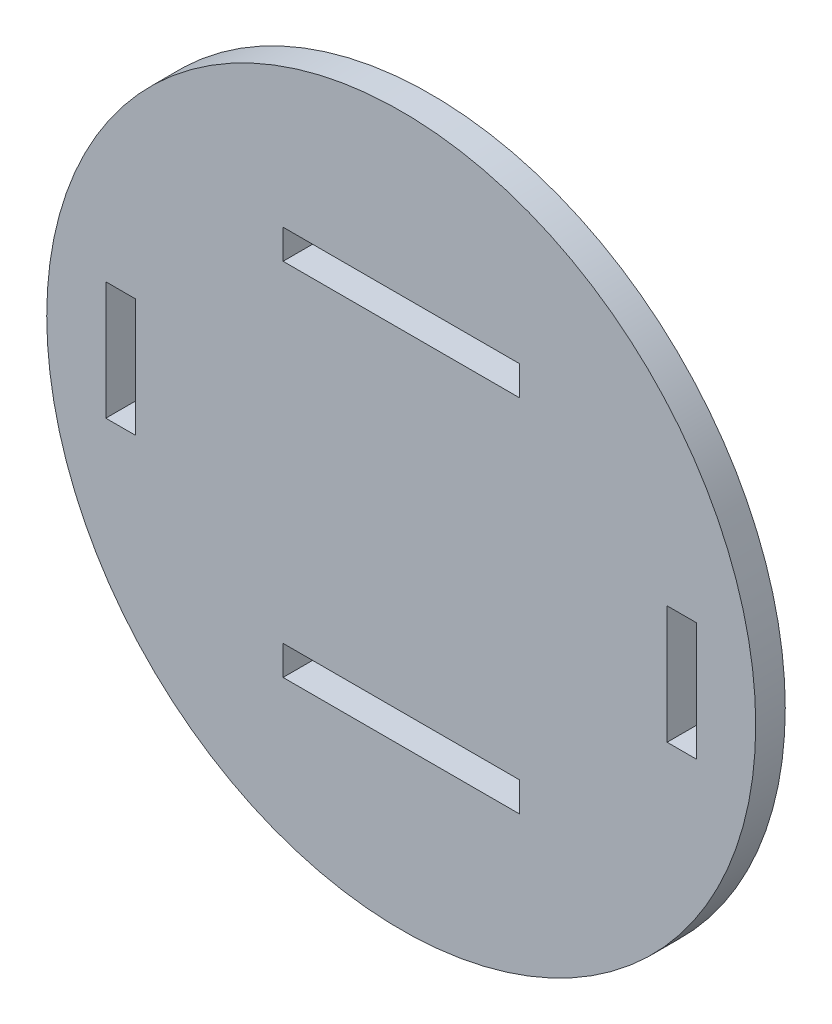
ISO-10303-21;
HEADER;
FILE_DESCRIPTION(('STEP AP214'),'2;1');
FILE_NAME('part.step','',(''),(''),'','','');
FILE_SCHEMA(('AUTOMOTIVE_DESIGN { 1 0 10303 214 1 1 1 1 }'));
ENDSEC;
DATA;
#1=APPLICATION_CONTEXT('core data for automotive mechanical design processes');
#2=APPLICATION_PROTOCOL_DEFINITION('international standard','automotive_design',2000,#1);
#3=PRODUCT_CONTEXT('',#1,'mechanical');
#4=PRODUCT('Part','Part','',(#3));
#5=PRODUCT_RELATED_PRODUCT_CATEGORY('part','',(#4));
#6=PRODUCT_DEFINITION_FORMATION('','',#4);
#7=PRODUCT_DEFINITION_CONTEXT('part definition',#1,'design');
#8=PRODUCT_DEFINITION('design','',#6,#7);
#9=PRODUCT_DEFINITION_SHAPE('','',#8);
#10=(LENGTH_UNIT() NAMED_UNIT(*) SI_UNIT(.MILLI.,.METRE.));
#11=(NAMED_UNIT(*) PLANE_ANGLE_UNIT() SI_UNIT($,.RADIAN.));
#12=(NAMED_UNIT(*) SI_UNIT($,.STERADIAN.) SOLID_ANGLE_UNIT());
#13=UNCERTAINTY_MEASURE_WITH_UNIT(LENGTH_MEASURE(1.E-05),#10,'distance_accuracy_value','');
#14=(GEOMETRIC_REPRESENTATION_CONTEXT(3) GLOBAL_UNCERTAINTY_ASSIGNED_CONTEXT((#13)) GLOBAL_UNIT_ASSIGNED_CONTEXT((#10,
#11,#12)) REPRESENTATION_CONTEXT('',''));
#15=CARTESIAN_POINT('',(0.,0.,0.));
#16=DIRECTION('',(0.,0.,1.));
#17=DIRECTION('',(1.,0.,0.));
#18=AXIS2_PLACEMENT_3D('',#15,#16,#17);
#19=CARTESIAN_POINT('',(0.,0.,3.175));
#20=DIRECTION('',(0.,0.,1.));
#21=DIRECTION('',(1.,0.,0.));
#22=AXIS2_PLACEMENT_3D('',#19,#20,#21);
#23=PLANE('',#22);
#24=CARTESIAN_POINT('',(0.,0.,3.175));
#25=DIRECTION('',(0.,0.,1.));
#26=DIRECTION('',(1.,0.,0.));
#27=AXIS2_PLACEMENT_3D('',#24,#25,#26);
#28=CIRCLE('',#27,38.1);
#29=CARTESIAN_POINT('',(38.1,0.,3.175));
#30=VERTEX_POINT('',#29);
#31=EDGE_CURVE('E11',#30,#30,#28,.T.);
#32=ORIENTED_EDGE('',*,*,#31,.T.);
#33=EDGE_LOOP('',(#32));
#34=FACE_BOUND('',#33,.T.);
#35=DIRECTION('',(0.,1.,0.));
#36=VECTOR('',#35,1.);
#37=CARTESIAN_POINT('',(31.75,6.35,3.175));
#38=LINE('',#37,#36);
#39=CARTESIAN_POINT('',(31.75,-6.35,3.175));
#40=VERTEX_POINT('',#39);
#41=CARTESIAN_POINT('',(31.75,6.35,3.175));
#42=VERTEX_POINT('',#41);
#43=EDGE_CURVE('E292',#40,#42,#38,.T.);
#44=ORIENTED_EDGE('',*,*,#43,.F.);
#45=DIRECTION('',(1.,0.,0.));
#46=VECTOR('',#45,1.);
#47=CARTESIAN_POINT('',(31.75,-6.35,3.175));
#48=LINE('',#47,#46);
#49=CARTESIAN_POINT('',(28.575,-6.35,3.175));
#50=VERTEX_POINT('',#49);
#51=EDGE_CURVE('E288',#50,#40,#48,.T.);
#52=ORIENTED_EDGE('',*,*,#51,.F.);
#53=DIRECTION('',(0.,-1.,0.));
#54=VECTOR('',#53,1.);
#55=CARTESIAN_POINT('',(28.575,-6.35,3.175));
#56=LINE('',#55,#54);
#57=CARTESIAN_POINT('',(28.575,6.35,3.175));
#58=VERTEX_POINT('',#57);
#59=EDGE_CURVE('E285',#58,#50,#56,.T.);
#60=ORIENTED_EDGE('',*,*,#59,.F.);
#61=DIRECTION('',(-1.,0.,0.));
#62=VECTOR('',#61,1.);
#63=CARTESIAN_POINT('',(28.575,6.35,3.175));
#64=LINE('',#63,#62);
#65=EDGE_CURVE('E295',#42,#58,#64,.T.);
#66=ORIENTED_EDGE('',*,*,#65,.F.);
#67=EDGE_LOOP('',(#44,#52,#60,#66));
#68=FACE_BOUND('',#67,.T.);
#69=DIRECTION('',(0.,-1.,0.));
#70=VECTOR('',#69,1.);
#71=CARTESIAN_POINT('',(-31.75,6.35,3.175));
#72=LINE('',#71,#70);
#73=CARTESIAN_POINT('',(-31.75,6.35,3.175));
#74=VERTEX_POINT('',#73);
#75=CARTESIAN_POINT('',(-31.75,-6.35,3.175));
#76=VERTEX_POINT('',#75);
#77=EDGE_CURVE('E251',#74,#76,#72,.T.);
#78=ORIENTED_EDGE('',*,*,#77,.F.);
#79=DIRECTION('',(-1.,0.,0.));
#80=VECTOR('',#79,1.);
#81=CARTESIAN_POINT('',(-28.575,6.35,3.175));
#82=LINE('',#81,#80);
#83=CARTESIAN_POINT('',(-28.575,6.35,3.175));
#84=VERTEX_POINT('',#83);
#85=EDGE_CURVE('E247',#84,#74,#82,.T.);
#86=ORIENTED_EDGE('',*,*,#85,.F.);
#87=DIRECTION('',(0.,1.,0.));
#88=VECTOR('',#87,1.);
#89=CARTESIAN_POINT('',(-28.575,0.,3.175));
#90=LINE('',#89,#88);
#91=CARTESIAN_POINT('',(-28.575,-6.35,3.175));
#92=VERTEX_POINT('',#91);
#93=EDGE_CURVE('E244',#92,#84,#90,.T.);
#94=ORIENTED_EDGE('',*,*,#93,.F.);
#95=DIRECTION('',(1.,0.,0.));
#96=VECTOR('',#95,1.);
#97=CARTESIAN_POINT('',(-31.75,-6.35,3.175));
#98=LINE('',#97,#96);
#99=EDGE_CURVE('E254',#76,#92,#98,.T.);
#100=ORIENTED_EDGE('',*,*,#99,.F.);
#101=EDGE_LOOP('',(#78,#86,#94,#100));
#102=FACE_BOUND('',#101,.T.);
#103=DIRECTION('',(1.,0.,0.));
#104=VECTOR('',#103,1.);
#105=CARTESIAN_POINT('',(12.7,-20.955,3.175));
#106=LINE('',#105,#104);
#107=CARTESIAN_POINT('',(-12.7,-20.955,3.175));
#108=VERTEX_POINT('',#107);
#109=CARTESIAN_POINT('',(12.7,-20.955,3.175));
#110=VERTEX_POINT('',#109);
#111=EDGE_CURVE('E212',#108,#110,#106,.T.);
#112=ORIENTED_EDGE('',*,*,#111,.F.);
#113=DIRECTION('',(0.,-1.,0.));
#114=VECTOR('',#113,1.);
#115=CARTESIAN_POINT('',(-12.7,-20.955,3.175));
#116=LINE('',#115,#114);
#117=CARTESIAN_POINT('',(-12.7,-17.78,3.175));
#118=VERTEX_POINT('',#117);
#119=EDGE_CURVE('E208',#118,#108,#116,.T.);
#120=ORIENTED_EDGE('',*,*,#119,.F.);
#121=DIRECTION('',(-1.,0.,0.));
#122=VECTOR('',#121,1.);
#123=CARTESIAN_POINT('',(-12.7,-17.78,3.175));
#124=LINE('',#123,#122);
#125=CARTESIAN_POINT('',(12.7,-17.78,3.175));
#126=VERTEX_POINT('',#125);
#127=EDGE_CURVE('E205',#126,#118,#124,.T.);
#128=ORIENTED_EDGE('',*,*,#127,.F.);
#129=DIRECTION('',(0.,1.,0.));
#130=VECTOR('',#129,1.);
#131=CARTESIAN_POINT('',(12.7,-17.78,3.175));
#132=LINE('',#131,#130);
#133=EDGE_CURVE('E215',#110,#126,#132,.T.);
#134=ORIENTED_EDGE('',*,*,#133,.F.);
#135=EDGE_LOOP('',(#112,#120,#128,#134));
#136=FACE_BOUND('',#135,.T.);
#137=DIRECTION('',(0.,1.,0.));
#138=VECTOR('',#137,1.);
#139=CARTESIAN_POINT('',(12.7,17.78,3.175));
#140=LINE('',#139,#138);
#141=CARTESIAN_POINT('',(12.7,17.78,3.175));
#142=VERTEX_POINT('',#141);
#143=CARTESIAN_POINT('',(12.7,20.955,3.175));
#144=VERTEX_POINT('',#143);
#145=EDGE_CURVE('E164',#142,#144,#140,.T.);
#146=ORIENTED_EDGE('',*,*,#145,.F.);
#147=DIRECTION('',(1.,0.,0.));
#148=VECTOR('',#147,1.);
#149=CARTESIAN_POINT('',(0.,17.78,3.175));
#150=LINE('',#149,#148);
#151=CARTESIAN_POINT('',(-12.7,17.78,3.175));
#152=VERTEX_POINT('',#151);
#153=EDGE_CURVE('E153',#152,#142,#150,.T.);
#154=ORIENTED_EDGE('',*,*,#153,.F.);
#155=DIRECTION('',(0.,-1.,0.));
#156=VECTOR('',#155,1.);
#157=CARTESIAN_POINT('',(-12.7,20.955,3.175));
#158=LINE('',#157,#156);
#159=CARTESIAN_POINT('',(-12.7,20.955,3.175));
#160=VERTEX_POINT('',#159);
#161=EDGE_CURVE('E181',#160,#152,#158,.T.);
#162=ORIENTED_EDGE('',*,*,#161,.F.);
#163=DIRECTION('',(-1.,0.,0.));
#164=VECTOR('',#163,1.);
#165=CARTESIAN_POINT('',(12.7,20.955,3.175));
#166=LINE('',#165,#164);
#167=EDGE_CURVE('E177',#144,#160,#166,.T.);
#168=ORIENTED_EDGE('',*,*,#167,.F.);
#169=EDGE_LOOP('',(#146,#154,#162,#168));
#170=FACE_BOUND('',#169,.T.);
#171=ADVANCED_FACE('F39',(#34,#68,#102,#136,#170),#23,.T.);
#172=CARTESIAN_POINT('',(0.,0.,0.));
#173=DIRECTION('',(0.,0.,1.));
#174=DIRECTION('',(1.,0.,0.));
#175=AXIS2_PLACEMENT_3D('',#172,#173,#174);
#176=PLANE('',#175);
#177=DIRECTION('',(0.,-1.,0.));
#178=VECTOR('',#177,1.);
#179=CARTESIAN_POINT('',(-12.7,-20.955,0.));
#180=LINE('',#179,#178);
#181=CARTESIAN_POINT('',(-12.7,-17.78,0.));
#182=VERTEX_POINT('',#181);
#183=CARTESIAN_POINT('',(-12.7,-20.955,0.));
#184=VERTEX_POINT('',#183);
#185=EDGE_CURVE('E218',#182,#184,#180,.T.);
#186=ORIENTED_EDGE('',*,*,#185,.T.);
#187=DIRECTION('',(1.,0.,0.));
#188=VECTOR('',#187,1.);
#189=CARTESIAN_POINT('',(12.7,-20.955,0.));
#190=LINE('',#189,#188);
#191=CARTESIAN_POINT('',(12.7,-20.955,0.));
#192=VERTEX_POINT('',#191);
#193=EDGE_CURVE('E222',#184,#192,#190,.T.);
#194=ORIENTED_EDGE('',*,*,#193,.T.);
#195=DIRECTION('',(0.,1.,0.));
#196=VECTOR('',#195,1.);
#197=CARTESIAN_POINT('',(12.7,-17.78,0.));
#198=LINE('',#197,#196);
#199=CARTESIAN_POINT('',(12.7,-17.78,0.));
#200=VERTEX_POINT('',#199);
#201=EDGE_CURVE('E227',#192,#200,#198,.T.);
#202=ORIENTED_EDGE('',*,*,#201,.T.);
#203=DIRECTION('',(-1.,0.,0.));
#204=VECTOR('',#203,1.);
#205=CARTESIAN_POINT('',(0.,-17.78,0.));
#206=LINE('',#205,#204);
#207=EDGE_CURVE('E209',#200,#182,#206,.T.);
#208=ORIENTED_EDGE('',*,*,#207,.T.);
#209=EDGE_LOOP('',(#186,#194,#202,#208));
#210=FACE_BOUND('',#209,.T.);
#211=DIRECTION('',(1.,0.,0.));
#212=VECTOR('',#211,1.);
#213=CARTESIAN_POINT('',(31.75,-6.35,0.));
#214=LINE('',#213,#212);
#215=CARTESIAN_POINT('',(28.575,-6.35,0.));
#216=VERTEX_POINT('',#215);
#217=CARTESIAN_POINT('',(31.75,-6.35,0.));
#218=VERTEX_POINT('',#217);
#219=EDGE_CURVE('E300',#216,#218,#214,.T.);
#220=ORIENTED_EDGE('',*,*,#219,.T.);
#221=DIRECTION('',(0.,1.,0.));
#222=VECTOR('',#221,1.);
#223=CARTESIAN_POINT('',(31.75,6.35,0.));
#224=LINE('',#223,#222);
#225=CARTESIAN_POINT('',(31.75,6.35,0.));
#226=VERTEX_POINT('',#225);
#227=EDGE_CURVE('E304',#218,#226,#224,.T.);
#228=ORIENTED_EDGE('',*,*,#227,.T.);
#229=DIRECTION('',(-1.,0.,0.));
#230=VECTOR('',#229,1.);
#231=CARTESIAN_POINT('',(28.575,6.35,0.));
#232=LINE('',#231,#230);
#233=CARTESIAN_POINT('',(28.575,6.35,0.));
#234=VERTEX_POINT('',#233);
#235=EDGE_CURVE('E308',#226,#234,#232,.T.);
#236=ORIENTED_EDGE('',*,*,#235,.T.);
#237=DIRECTION('',(0.,-1.,0.));
#238=VECTOR('',#237,1.);
#239=CARTESIAN_POINT('',(28.575,0.,0.));
#240=LINE('',#239,#238);
#241=EDGE_CURVE('E289',#234,#216,#240,.T.);
#242=ORIENTED_EDGE('',*,*,#241,.T.);
#243=EDGE_LOOP('',(#220,#228,#236,#242));
#244=FACE_BOUND('',#243,.T.);
#245=CARTESIAN_POINT('',(0.,0.,0.));
#246=DIRECTION('',(0.,0.,1.));
#247=DIRECTION('',(1.,0.,0.));
#248=AXIS2_PLACEMENT_3D('',#245,#246,#247);
#249=CIRCLE('',#248,38.1);
#250=CARTESIAN_POINT('',(38.1,0.,0.));
#251=VERTEX_POINT('',#250);
#252=EDGE_CURVE('E43',#251,#251,#249,.T.);
#253=ORIENTED_EDGE('',*,*,#252,.F.);
#254=EDGE_LOOP('',(#253));
#255=FACE_BOUND('',#254,.T.);
#256=DIRECTION('',(-1.,0.,0.));
#257=VECTOR('',#256,1.);
#258=CARTESIAN_POINT('',(-28.575,6.35,0.));
#259=LINE('',#258,#257);
#260=CARTESIAN_POINT('',(-28.575,6.35,0.));
#261=VERTEX_POINT('',#260);
#262=CARTESIAN_POINT('',(-31.75,6.35,0.));
#263=VERTEX_POINT('',#262);
#264=EDGE_CURVE('E259',#261,#263,#259,.T.);
#265=ORIENTED_EDGE('',*,*,#264,.T.);
#266=DIRECTION('',(0.,-1.,0.));
#267=VECTOR('',#266,1.);
#268=CARTESIAN_POINT('',(-31.75,6.35,0.));
#269=LINE('',#268,#267);
#270=CARTESIAN_POINT('',(-31.75,-6.35,0.));
#271=VERTEX_POINT('',#270);
#272=EDGE_CURVE('E263',#263,#271,#269,.T.);
#273=ORIENTED_EDGE('',*,*,#272,.T.);
#274=DIRECTION('',(1.,0.,0.));
#275=VECTOR('',#274,1.);
#276=CARTESIAN_POINT('',(-31.75,-6.35,0.));
#277=LINE('',#276,#275);
#278=CARTESIAN_POINT('',(-28.575,-6.35,0.));
#279=VERTEX_POINT('',#278);
#280=EDGE_CURVE('E268',#271,#279,#277,.T.);
#281=ORIENTED_EDGE('',*,*,#280,.T.);
#282=DIRECTION('',(0.,1.,0.));
#283=VECTOR('',#282,1.);
#284=CARTESIAN_POINT('',(-28.575,0.,0.));
#285=LINE('',#284,#283);
#286=EDGE_CURVE('E248',#279,#261,#285,.T.);
#287=ORIENTED_EDGE('',*,*,#286,.T.);
#288=EDGE_LOOP('',(#265,#273,#281,#287));
#289=FACE_BOUND('',#288,.T.);
#290=DIRECTION('',(1.,0.,0.));
#291=VECTOR('',#290,1.);
#292=CARTESIAN_POINT('',(0.,17.78,0.));
#293=LINE('',#292,#291);
#294=CARTESIAN_POINT('',(-12.7,17.78,0.));
#295=VERTEX_POINT('',#294);
#296=CARTESIAN_POINT('',(12.7,17.78,0.));
#297=VERTEX_POINT('',#296);
#298=EDGE_CURVE('E186',#295,#297,#293,.T.);
#299=ORIENTED_EDGE('',*,*,#298,.T.);
#300=DIRECTION('',(0.,1.,0.));
#301=VECTOR('',#300,1.);
#302=CARTESIAN_POINT('',(12.7,17.78,0.));
#303=LINE('',#302,#301);
#304=CARTESIAN_POINT('',(12.7,20.955,0.));
#305=VERTEX_POINT('',#304);
#306=EDGE_CURVE('E171',#297,#305,#303,.T.);
#307=ORIENTED_EDGE('',*,*,#306,.T.);
#308=DIRECTION('',(-1.,0.,0.));
#309=VECTOR('',#308,1.);
#310=CARTESIAN_POINT('',(12.7,20.955,0.));
#311=LINE('',#310,#309);
#312=CARTESIAN_POINT('',(-12.7,20.955,0.));
#313=VERTEX_POINT('',#312);
#314=EDGE_CURVE('E192',#305,#313,#311,.T.);
#315=ORIENTED_EDGE('',*,*,#314,.T.);
#316=DIRECTION('',(0.,-1.,0.));
#317=VECTOR('',#316,1.);
#318=CARTESIAN_POINT('',(-12.7,20.955,0.));
#319=LINE('',#318,#317);
#320=EDGE_CURVE('E165',#313,#295,#319,.T.);
#321=ORIENTED_EDGE('',*,*,#320,.T.);
#322=EDGE_LOOP('',(#299,#307,#315,#321));
#323=FACE_BOUND('',#322,.T.);
#324=ADVANCED_FACE('F336',(#210,#244,#255,#289,#323),#176,.F.);
#325=CARTESIAN_POINT('',(0.,0.,3.175));
#326=DIRECTION('',(0.,0.,-1.));
#327=DIRECTION('',(-1.,0.,0.));
#328=AXIS2_PLACEMENT_3D('',#325,#326,#327);
#329=CYLINDRICAL_SURFACE('',#328,38.1);
#330=ORIENTED_EDGE('',*,*,#31,.F.);
#331=EDGE_LOOP('',(#330));
#332=FACE_BOUND('',#331,.T.);
#333=ORIENTED_EDGE('',*,*,#252,.T.);
#334=EDGE_LOOP('',(#333));
#335=FACE_BOUND('',#334,.T.);
#336=ADVANCED_FACE('F41',(#332,#335),#329,.T.);
#337=CARTESIAN_POINT('',(31.75,-6.35,3.175));
#338=DIRECTION('',(0.,1.,0.));
#339=DIRECTION('',(0.,0.,1.));
#340=AXIS2_PLACEMENT_3D('',#337,#338,#339);
#341=PLANE('',#340);
#342=ORIENTED_EDGE('',*,*,#219,.F.);
#343=DIRECTION('',(0.,0.,-1.));
#344=VECTOR('',#343,1.);
#345=CARTESIAN_POINT('',(28.575,-6.35,3.175));
#346=LINE('',#345,#344);
#347=EDGE_CURVE('E264',#50,#216,#346,.T.);
#348=ORIENTED_EDGE('',*,*,#347,.F.);
#349=ORIENTED_EDGE('',*,*,#51,.T.);
#350=DIRECTION('',(0.,0.,-1.));
#351=VECTOR('',#350,1.);
#352=CARTESIAN_POINT('',(31.75,-6.35,3.175));
#353=LINE('',#352,#351);
#354=EDGE_CURVE('E320',#40,#218,#353,.T.);
#355=ORIENTED_EDGE('',*,*,#354,.T.);
#356=EDGE_LOOP('',(#342,#348,#349,#355));
#357=FACE_BOUND('',#356,.T.);
#358=ADVANCED_FACE('F332',(#357),#341,.T.);
#359=CARTESIAN_POINT('',(31.75,6.35,3.175));
#360=DIRECTION('',(-1.,0.,0.));
#361=DIRECTION('',(0.,0.,1.));
#362=AXIS2_PLACEMENT_3D('',#359,#360,#361);
#363=PLANE('',#362);
#364=ORIENTED_EDGE('',*,*,#227,.F.);
#365=ORIENTED_EDGE('',*,*,#354,.F.);
#366=ORIENTED_EDGE('',*,*,#43,.T.);
#367=DIRECTION('',(0.,0.,-1.));
#368=VECTOR('',#367,1.);
#369=CARTESIAN_POINT('',(31.75,6.35,3.175));
#370=LINE('',#369,#368);
#371=EDGE_CURVE('E317',#42,#226,#370,.T.);
#372=ORIENTED_EDGE('',*,*,#371,.T.);
#373=EDGE_LOOP('',(#364,#365,#366,#372));
#374=FACE_BOUND('',#373,.T.);
#375=ADVANCED_FACE('F347',(#374),#363,.T.);
#376=CARTESIAN_POINT('',(28.575,6.35,3.175));
#377=DIRECTION('',(0.,-1.,0.));
#378=DIRECTION('',(0.,0.,-1.));
#379=AXIS2_PLACEMENT_3D('',#376,#377,#378);
#380=PLANE('',#379);
#381=ORIENTED_EDGE('',*,*,#235,.F.);
#382=ORIENTED_EDGE('',*,*,#371,.F.);
#383=ORIENTED_EDGE('',*,*,#65,.T.);
#384=DIRECTION('',(0.,0.,-1.));
#385=VECTOR('',#384,1.);
#386=CARTESIAN_POINT('',(28.575,6.35,3.175));
#387=LINE('',#386,#385);
#388=EDGE_CURVE('E299',#58,#234,#387,.T.);
#389=ORIENTED_EDGE('',*,*,#388,.T.);
#390=EDGE_LOOP('',(#381,#382,#383,#389));
#391=FACE_BOUND('',#390,.T.);
#392=ADVANCED_FACE('F341',(#391),#380,.T.);
#393=CARTESIAN_POINT('',(28.575,0.,3.175));
#394=DIRECTION('',(1.,0.,0.));
#395=DIRECTION('',(0.,0.,-1.));
#396=AXIS2_PLACEMENT_3D('',#393,#394,#395);
#397=PLANE('',#396);
#398=ORIENTED_EDGE('',*,*,#241,.F.);
#399=ORIENTED_EDGE('',*,*,#388,.F.);
#400=ORIENTED_EDGE('',*,*,#59,.T.);
#401=ORIENTED_EDGE('',*,*,#347,.T.);
#402=EDGE_LOOP('',(#398,#399,#400,#401));
#403=FACE_BOUND('',#402,.T.);
#404=ADVANCED_FACE('F328',(#403),#397,.T.);
#405=CARTESIAN_POINT('',(-28.575,6.35,3.175));
#406=DIRECTION('',(0.,-1.,0.));
#407=DIRECTION('',(0.,0.,-1.));
#408=AXIS2_PLACEMENT_3D('',#405,#406,#407);
#409=PLANE('',#408);
#410=ORIENTED_EDGE('',*,*,#264,.F.);
#411=DIRECTION('',(0.,0.,-1.));
#412=VECTOR('',#411,1.);
#413=CARTESIAN_POINT('',(-28.575,6.35,3.175));
#414=LINE('',#413,#412);
#415=EDGE_CURVE('E223',#84,#261,#414,.T.);
#416=ORIENTED_EDGE('',*,*,#415,.F.);
#417=ORIENTED_EDGE('',*,*,#85,.T.);
#418=DIRECTION('',(0.,0.,-1.));
#419=VECTOR('',#418,1.);
#420=CARTESIAN_POINT('',(-31.75,6.35,3.175));
#421=LINE('',#420,#419);
#422=EDGE_CURVE('E280',#74,#263,#421,.T.);
#423=ORIENTED_EDGE('',*,*,#422,.T.);
#424=EDGE_LOOP('',(#410,#416,#417,#423));
#425=FACE_BOUND('',#424,.T.);
#426=ADVANCED_FACE('F414',(#425),#409,.T.);
#427=CARTESIAN_POINT('',(-31.75,6.35,3.175));
#428=DIRECTION('',(1.,0.,0.));
#429=DIRECTION('',(0.,0.,-1.));
#430=AXIS2_PLACEMENT_3D('',#427,#428,#429);
#431=PLANE('',#430);
#432=ORIENTED_EDGE('',*,*,#272,.F.);
#433=ORIENTED_EDGE('',*,*,#422,.F.);
#434=ORIENTED_EDGE('',*,*,#77,.T.);
#435=DIRECTION('',(0.,0.,-1.));
#436=VECTOR('',#435,1.);
#437=CARTESIAN_POINT('',(-31.75,-6.35,3.175));
#438=LINE('',#437,#436);
#439=EDGE_CURVE('E277',#76,#271,#438,.T.);
#440=ORIENTED_EDGE('',*,*,#439,.T.);
#441=EDGE_LOOP('',(#432,#433,#434,#440));
#442=FACE_BOUND('',#441,.T.);
#443=ADVANCED_FACE('F410',(#442),#431,.T.);
#444=CARTESIAN_POINT('',(-31.75,-6.35,3.175));
#445=DIRECTION('',(0.,1.,0.));
#446=DIRECTION('',(0.,0.,1.));
#447=AXIS2_PLACEMENT_3D('',#444,#445,#446);
#448=PLANE('',#447);
#449=ORIENTED_EDGE('',*,*,#280,.F.);
#450=ORIENTED_EDGE('',*,*,#439,.F.);
#451=ORIENTED_EDGE('',*,*,#99,.T.);
#452=DIRECTION('',(0.,0.,-1.));
#453=VECTOR('',#452,1.);
#454=CARTESIAN_POINT('',(-28.575,-6.35,3.175));
#455=LINE('',#454,#453);
#456=EDGE_CURVE('E258',#92,#279,#455,.T.);
#457=ORIENTED_EDGE('',*,*,#456,.T.);
#458=EDGE_LOOP('',(#449,#450,#451,#457));
#459=FACE_BOUND('',#458,.T.);
#460=ADVANCED_FACE('F406',(#459),#448,.T.);
#461=CARTESIAN_POINT('',(-28.575,0.,3.175));
#462=DIRECTION('',(-1.,0.,0.));
#463=DIRECTION('',(0.,0.,1.));
#464=AXIS2_PLACEMENT_3D('',#461,#462,#463);
#465=PLANE('',#464);
#466=ORIENTED_EDGE('',*,*,#286,.F.);
#467=ORIENTED_EDGE('',*,*,#456,.F.);
#468=ORIENTED_EDGE('',*,*,#93,.T.);
#469=ORIENTED_EDGE('',*,*,#415,.T.);
#470=EDGE_LOOP('',(#466,#467,#468,#469));
#471=FACE_BOUND('',#470,.T.);
#472=ADVANCED_FACE('F402',(#471),#465,.T.);
#473=CARTESIAN_POINT('',(-12.7,-20.955,3.175));
#474=DIRECTION('',(1.,0.,0.));
#475=DIRECTION('',(0.,0.,-1.));
#476=AXIS2_PLACEMENT_3D('',#473,#474,#475);
#477=PLANE('',#476);
#478=ORIENTED_EDGE('',*,*,#185,.F.);
#479=DIRECTION('',(0.,0.,-1.));
#480=VECTOR('',#479,1.);
#481=CARTESIAN_POINT('',(-12.7,-17.78,3.175));
#482=LINE('',#481,#480);
#483=EDGE_CURVE('E189',#118,#182,#482,.T.);
#484=ORIENTED_EDGE('',*,*,#483,.F.);
#485=ORIENTED_EDGE('',*,*,#119,.T.);
#486=DIRECTION('',(0.,0.,-1.));
#487=VECTOR('',#486,1.);
#488=CARTESIAN_POINT('',(-12.7,-20.955,3.175));
#489=LINE('',#488,#487);
#490=EDGE_CURVE('E239',#108,#184,#489,.T.);
#491=ORIENTED_EDGE('',*,*,#490,.T.);
#492=EDGE_LOOP('',(#478,#484,#485,#491));
#493=FACE_BOUND('',#492,.T.);
#494=ADVANCED_FACE('F398',(#493),#477,.T.);
#495=CARTESIAN_POINT('',(12.7,-20.955,3.175));
#496=DIRECTION('',(0.,1.,0.));
#497=DIRECTION('',(0.,0.,1.));
#498=AXIS2_PLACEMENT_3D('',#495,#496,#497);
#499=PLANE('',#498);
#500=ORIENTED_EDGE('',*,*,#193,.F.);
#501=ORIENTED_EDGE('',*,*,#490,.F.);
#502=ORIENTED_EDGE('',*,*,#111,.T.);
#503=DIRECTION('',(0.,0.,-1.));
#504=VECTOR('',#503,1.);
#505=CARTESIAN_POINT('',(12.7,-20.955,3.175));
#506=LINE('',#505,#504);
#507=EDGE_CURVE('E236',#110,#192,#506,.T.);
#508=ORIENTED_EDGE('',*,*,#507,.T.);
#509=EDGE_LOOP('',(#500,#501,#502,#508));
#510=FACE_BOUND('',#509,.T.);
#511=ADVANCED_FACE('F394',(#510),#499,.T.);
#512=CARTESIAN_POINT('',(12.7,-17.78,3.175));
#513=DIRECTION('',(-1.,0.,0.));
#514=DIRECTION('',(0.,0.,1.));
#515=AXIS2_PLACEMENT_3D('',#512,#513,#514);
#516=PLANE('',#515);
#517=ORIENTED_EDGE('',*,*,#201,.F.);
#518=ORIENTED_EDGE('',*,*,#507,.F.);
#519=ORIENTED_EDGE('',*,*,#133,.T.);
#520=DIRECTION('',(0.,0.,-1.));
#521=VECTOR('',#520,1.);
#522=CARTESIAN_POINT('',(12.7,-17.78,3.175));
#523=LINE('',#522,#521);
#524=EDGE_CURVE('E63',#126,#200,#523,.T.);
#525=ORIENTED_EDGE('',*,*,#524,.T.);
#526=EDGE_LOOP('',(#517,#518,#519,#525));
#527=FACE_BOUND('',#526,.T.);
#528=ADVANCED_FACE('F391',(#527),#516,.T.);
#529=CARTESIAN_POINT('',(0.,-17.78,3.175));
#530=DIRECTION('',(0.,-1.,0.));
#531=DIRECTION('',(0.,0.,-1.));
#532=AXIS2_PLACEMENT_3D('',#529,#530,#531);
#533=PLANE('',#532);
#534=ORIENTED_EDGE('',*,*,#207,.F.);
#535=ORIENTED_EDGE('',*,*,#524,.F.);
#536=ORIENTED_EDGE('',*,*,#127,.T.);
#537=ORIENTED_EDGE('',*,*,#483,.T.);
#538=EDGE_LOOP('',(#534,#535,#536,#537));
#539=FACE_BOUND('',#538,.T.);
#540=ADVANCED_FACE('F388',(#539),#533,.T.);
#541=CARTESIAN_POINT('',(0.,17.78,3.175));
#542=DIRECTION('',(0.,1.,0.));
#543=DIRECTION('',(0.,0.,1.));
#544=AXIS2_PLACEMENT_3D('',#541,#542,#543);
#545=PLANE('',#544);
#546=ORIENTED_EDGE('',*,*,#298,.F.);
#547=DIRECTION('',(0.,0.,-1.));
#548=VECTOR('',#547,1.);
#549=CARTESIAN_POINT('',(-12.7,17.78,3.175));
#550=LINE('',#549,#548);
#551=EDGE_CURVE('E159',#152,#295,#550,.T.);
#552=ORIENTED_EDGE('',*,*,#551,.F.);
#553=ORIENTED_EDGE('',*,*,#153,.T.);
#554=DIRECTION('',(0.,0.,-1.));
#555=VECTOR('',#554,1.);
#556=CARTESIAN_POINT('',(12.7,17.78,3.175));
#557=LINE('',#556,#555);
#558=EDGE_CURVE('E157',#142,#297,#557,.T.);
#559=ORIENTED_EDGE('',*,*,#558,.T.);
#560=EDGE_LOOP('',(#546,#552,#553,#559));
#561=FACE_BOUND('',#560,.T.);
#562=ADVANCED_FACE('F156',(#561),#545,.T.);
#563=CARTESIAN_POINT('',(12.7,17.78,3.175));
#564=DIRECTION('',(-1.,0.,0.));
#565=DIRECTION('',(0.,0.,1.));
#566=AXIS2_PLACEMENT_3D('',#563,#564,#565);
#567=PLANE('',#566);
#568=ORIENTED_EDGE('',*,*,#306,.F.);
#569=ORIENTED_EDGE('',*,*,#558,.F.);
#570=ORIENTED_EDGE('',*,*,#145,.T.);
#571=DIRECTION('',(0.,0.,-1.));
#572=VECTOR('',#571,1.);
#573=CARTESIAN_POINT('',(12.7,20.955,3.175));
#574=LINE('',#573,#572);
#575=EDGE_CURVE('E174',#144,#305,#574,.T.);
#576=ORIENTED_EDGE('',*,*,#575,.T.);
#577=EDGE_LOOP('',(#568,#569,#570,#576));
#578=FACE_BOUND('',#577,.T.);
#579=ADVANCED_FACE('F168',(#578),#567,.T.);
#580=CARTESIAN_POINT('',(12.7,20.955,3.175));
#581=DIRECTION('',(0.,-1.,0.));
#582=DIRECTION('',(0.,0.,-1.));
#583=AXIS2_PLACEMENT_3D('',#580,#581,#582);
#584=PLANE('',#583);
#585=ORIENTED_EDGE('',*,*,#314,.F.);
#586=ORIENTED_EDGE('',*,*,#575,.F.);
#587=ORIENTED_EDGE('',*,*,#167,.T.);
#588=DIRECTION('',(0.,0.,-1.));
#589=VECTOR('',#588,1.);
#590=CARTESIAN_POINT('',(-12.7,20.955,3.175));
#591=LINE('',#590,#589);
#592=EDGE_CURVE('E55',#160,#313,#591,.T.);
#593=ORIENTED_EDGE('',*,*,#592,.T.);
#594=EDGE_LOOP('',(#585,#586,#587,#593));
#595=FACE_BOUND('',#594,.T.);
#596=ADVANCED_FACE('F376',(#595),#584,.T.);
#597=CARTESIAN_POINT('',(-12.7,20.955,3.175));
#598=DIRECTION('',(1.,0.,0.));
#599=DIRECTION('',(0.,0.,-1.));
#600=AXIS2_PLACEMENT_3D('',#597,#598,#599);
#601=PLANE('',#600);
#602=ORIENTED_EDGE('',*,*,#320,.F.);
#603=ORIENTED_EDGE('',*,*,#592,.F.);
#604=ORIENTED_EDGE('',*,*,#161,.T.);
#605=ORIENTED_EDGE('',*,*,#551,.T.);
#606=EDGE_LOOP('',(#602,#603,#604,#605));
#607=FACE_BOUND('',#606,.T.);
#608=ADVANCED_FACE('F374',(#607),#601,.T.);
#609=CLOSED_SHELL('',(#171,#324,#336,#358,#375,#392,#404,#426,#443,#460,#472,#494,#511,#528,
#540,#562,#579,#596,#608));
#610=MANIFOLD_SOLID_BREP('B2',#609);
#611=ADVANCED_BREP_SHAPE_REPRESENTATION('',(#18,#610),#14);
#612=SHAPE_DEFINITION_REPRESENTATION(#9,#611);
ENDSEC;
END-ISO-10303-21;
